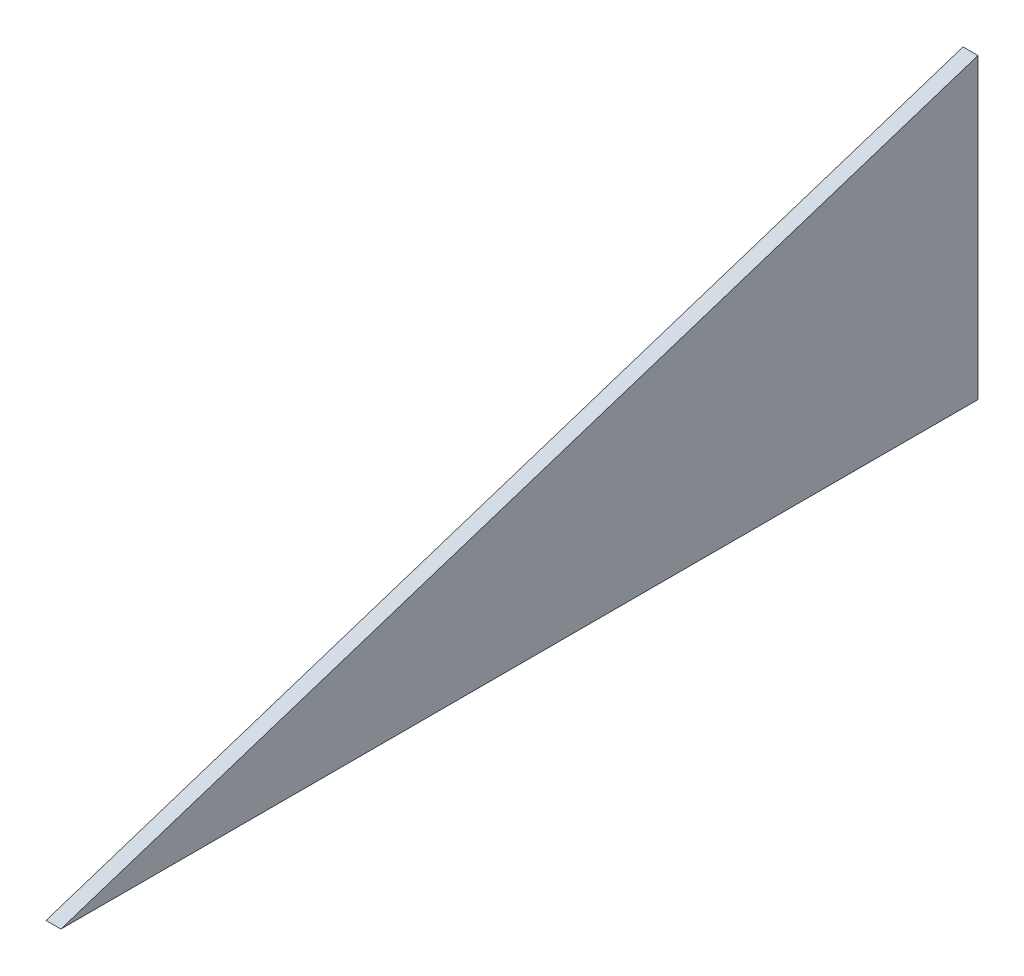
ISO-10303-21;
HEADER;
FILE_DESCRIPTION(('STEP AP214'),'2;1');
FILE_NAME('part.step','',(''),(''),'','','');
FILE_SCHEMA(('AUTOMOTIVE_DESIGN { 1 0 10303 214 1 1 1 1 }'));
ENDSEC;
DATA;
#1=APPLICATION_CONTEXT('core data for automotive mechanical design processes');
#2=APPLICATION_PROTOCOL_DEFINITION('international standard','automotive_design',2000,#1);
#3=PRODUCT_CONTEXT('',#1,'mechanical');
#4=PRODUCT('Part','Part','',(#3));
#5=PRODUCT_RELATED_PRODUCT_CATEGORY('part','',(#4));
#6=PRODUCT_DEFINITION_FORMATION('','',#4);
#7=PRODUCT_DEFINITION_CONTEXT('part definition',#1,'design');
#8=PRODUCT_DEFINITION('design','',#6,#7);
#9=PRODUCT_DEFINITION_SHAPE('','',#8);
#10=(LENGTH_UNIT() NAMED_UNIT(*) SI_UNIT(.MILLI.,.METRE.));
#11=(NAMED_UNIT(*) PLANE_ANGLE_UNIT() SI_UNIT($,.RADIAN.));
#12=(NAMED_UNIT(*) SI_UNIT($,.STERADIAN.) SOLID_ANGLE_UNIT());
#13=UNCERTAINTY_MEASURE_WITH_UNIT(LENGTH_MEASURE(1.E-05),#10,'distance_accuracy_value','');
#14=(GEOMETRIC_REPRESENTATION_CONTEXT(3) GLOBAL_UNCERTAINTY_ASSIGNED_CONTEXT((#13)) GLOBAL_UNIT_ASSIGNED_CONTEXT((#10,
#11,#12)) REPRESENTATION_CONTEXT('',''));
#15=CARTESIAN_POINT('',(0.,0.,0.));
#16=DIRECTION('',(0.,0.,1.));
#17=DIRECTION('',(1.,0.,0.));
#18=AXIS2_PLACEMENT_3D('',#15,#16,#17);
#19=CARTESIAN_POINT('',(5.,0.,-307.768353717532));
#20=DIRECTION('',(0.,1.,0.));
#21=DIRECTION('',(0.,0.,1.));
#22=AXIS2_PLACEMENT_3D('',#19,#20,#21);
#23=PLANE('',#22);
#24=DIRECTION('',(0.,0.,-1.));
#25=VECTOR('',#24,1.);
#26=CARTESIAN_POINT('',(0.,0.,-307.768353717532));
#27=LINE('',#26,#25);
#28=CARTESIAN_POINT('',(0.,0.,0.));
#29=VERTEX_POINT('',#28);
#30=CARTESIAN_POINT('',(0.,0.,-307.768353717532));
#31=VERTEX_POINT('',#30);
#32=EDGE_CURVE('E84',#29,#31,#27,.T.);
#33=ORIENTED_EDGE('',*,*,#32,.T.);
#34=DIRECTION('',(-1.,0.,0.));
#35=VECTOR('',#34,1.);
#36=CARTESIAN_POINT('',(5.,0.,-307.768353717532));
#37=LINE('',#36,#35);
#38=CARTESIAN_POINT('',(5.,0.,-307.768353717532));
#39=VERTEX_POINT('',#38);
#40=EDGE_CURVE('E11',#39,#31,#37,.T.);
#41=ORIENTED_EDGE('',*,*,#40,.F.);
#42=DIRECTION('',(0.,0.,-1.));
#43=VECTOR('',#42,1.);
#44=CARTESIAN_POINT('',(5.,0.,-307.768353717532));
#45=LINE('',#44,#43);
#46=CARTESIAN_POINT('',(5.,0.,0.));
#47=VERTEX_POINT('',#46);
#48=EDGE_CURVE('E77',#47,#39,#45,.T.);
#49=ORIENTED_EDGE('',*,*,#48,.F.);
#50=DIRECTION('',(-1.,0.,0.));
#51=VECTOR('',#50,1.);
#52=CARTESIAN_POINT('',(5.,0.,0.));
#53=LINE('',#52,#51);
#54=EDGE_CURVE('E85',#47,#29,#53,.T.);
#55=ORIENTED_EDGE('',*,*,#54,.T.);
#56=EDGE_LOOP('',(#33,#41,#49,#55));
#57=FACE_BOUND('',#56,.T.);
#58=ADVANCED_FACE('F37',(#57),#23,.F.);
#59=CARTESIAN_POINT('',(5.,100.,-307.768353717532));
#60=DIRECTION('',(0.,0.,1.));
#61=DIRECTION('',(1.,0.,0.));
#62=AXIS2_PLACEMENT_3D('',#59,#60,#61);
#63=PLANE('',#62);
#64=DIRECTION('',(0.,1.,0.));
#65=VECTOR('',#64,1.);
#66=CARTESIAN_POINT('',(0.,100.,-307.768353717532));
#67=LINE('',#66,#65);
#68=CARTESIAN_POINT('',(0.,100.,-307.768353717532));
#69=VERTEX_POINT('',#68);
#70=EDGE_CURVE('E65',#31,#69,#67,.T.);
#71=ORIENTED_EDGE('',*,*,#70,.T.);
#72=DIRECTION('',(-1.,0.,0.));
#73=VECTOR('',#72,1.);
#74=CARTESIAN_POINT('',(5.,100.,-307.768353717532));
#75=LINE('',#74,#73);
#76=CARTESIAN_POINT('',(5.,100.,-307.768353717532));
#77=VERTEX_POINT('',#76);
#78=EDGE_CURVE('E45',#77,#69,#75,.T.);
#79=ORIENTED_EDGE('',*,*,#78,.F.);
#80=DIRECTION('',(0.,1.,0.));
#81=VECTOR('',#80,1.);
#82=CARTESIAN_POINT('',(5.,100.,-307.768353717532));
#83=LINE('',#82,#81);
#84=EDGE_CURVE('E73',#39,#77,#83,.T.);
#85=ORIENTED_EDGE('',*,*,#84,.F.);
#86=ORIENTED_EDGE('',*,*,#40,.T.);
#87=EDGE_LOOP('',(#71,#79,#85,#86));
#88=FACE_BOUND('',#87,.T.);
#89=ADVANCED_FACE('F74',(#88),#63,.F.);
#90=CARTESIAN_POINT('',(5.,0.,0.));
#91=DIRECTION('',(0.,-0.951056516295155,-0.309016994374942));
#92=DIRECTION('',(0.,0.309016994374942,-0.951056516295155));
#93=AXIS2_PLACEMENT_3D('',#90,#91,#92);
#94=PLANE('',#93);
#95=DIRECTION('',(0.,-0.309016994374942,0.951056516295155));
#96=VECTOR('',#95,1.);
#97=CARTESIAN_POINT('',(0.,0.,0.));
#98=LINE('',#97,#96);
#99=EDGE_CURVE('E70',#69,#29,#98,.T.);
#100=ORIENTED_EDGE('',*,*,#99,.T.);
#101=ORIENTED_EDGE('',*,*,#54,.F.);
#102=DIRECTION('',(0.,-0.309016994374942,0.951056516295155));
#103=VECTOR('',#102,1.);
#104=CARTESIAN_POINT('',(5.,0.,0.));
#105=LINE('',#104,#103);
#106=EDGE_CURVE('E53',#77,#47,#105,.T.);
#107=ORIENTED_EDGE('',*,*,#106,.F.);
#108=ORIENTED_EDGE('',*,*,#78,.T.);
#109=EDGE_LOOP('',(#100,#101,#107,#108));
#110=FACE_BOUND('',#109,.T.);
#111=ADVANCED_FACE('F92',(#110),#94,.F.);
#112=CARTESIAN_POINT('',(5.,0.,0.));
#113=DIRECTION('',(1.,0.,0.));
#114=DIRECTION('',(0.,0.,-1.));
#115=AXIS2_PLACEMENT_3D('',#112,#113,#114);
#116=PLANE('',#115);
#117=ORIENTED_EDGE('',*,*,#48,.T.);
#118=ORIENTED_EDGE('',*,*,#84,.T.);
#119=ORIENTED_EDGE('',*,*,#106,.T.);
#120=EDGE_LOOP('',(#117,#118,#119));
#121=FACE_BOUND('',#120,.T.);
#122=ADVANCED_FACE('F80',(#121),#116,.T.);
#123=CARTESIAN_POINT('',(0.,0.,0.));
#124=DIRECTION('',(1.,0.,0.));
#125=DIRECTION('',(0.,0.,-1.));
#126=AXIS2_PLACEMENT_3D('',#123,#124,#125);
#127=PLANE('',#126);
#128=ORIENTED_EDGE('',*,*,#32,.F.);
#129=ORIENTED_EDGE('',*,*,#99,.F.);
#130=ORIENTED_EDGE('',*,*,#70,.F.);
#131=EDGE_LOOP('',(#128,#129,#130));
#132=FACE_BOUND('',#131,.T.);
#133=ADVANCED_FACE('F93',(#132),#127,.F.);
#134=CLOSED_SHELL('',(#58,#89,#111,#122,#133));
#135=MANIFOLD_SOLID_BREP('B2',#134);
#136=ADVANCED_BREP_SHAPE_REPRESENTATION('',(#18,#135),#14);
#137=SHAPE_DEFINITION_REPRESENTATION(#9,#136);
ENDSEC;
END-ISO-10303-21;
